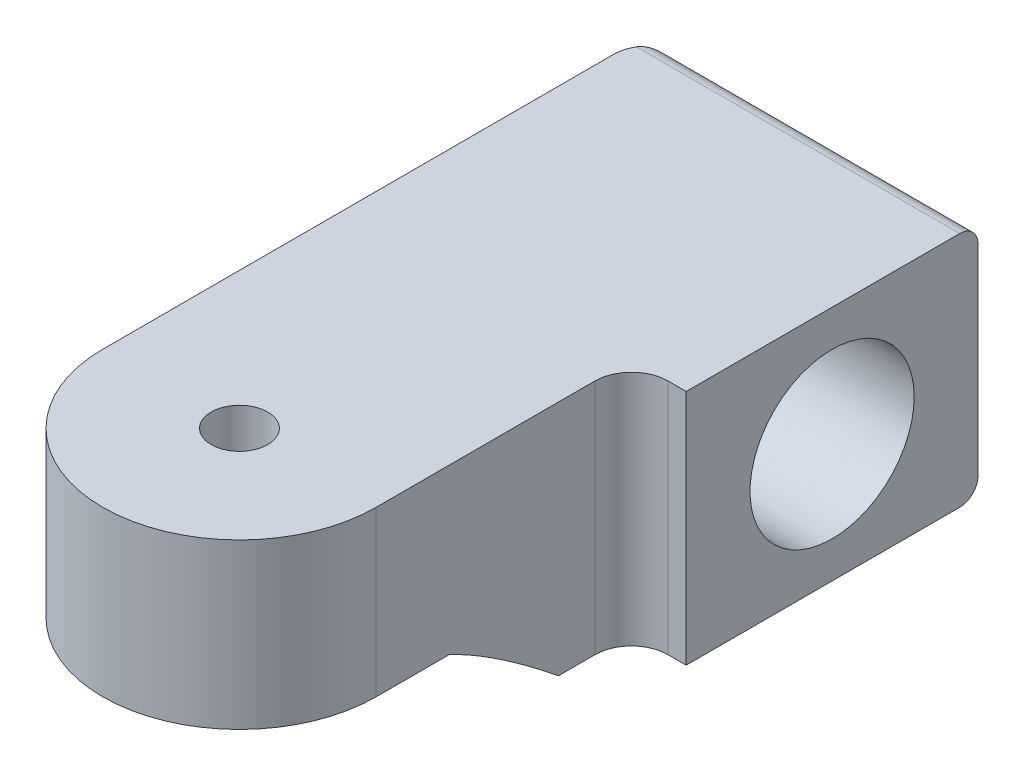
ISO-10303-21;
HEADER;
FILE_DESCRIPTION(('STEP AP214'),'2;1');
FILE_NAME('part.step','',(''),(''),'','','');
FILE_SCHEMA(('AUTOMOTIVE_DESIGN { 1 0 10303 214 1 1 1 1 }'));
ENDSEC;
DATA;
#1=APPLICATION_CONTEXT('core data for automotive mechanical design processes');
#2=APPLICATION_PROTOCOL_DEFINITION('international standard','automotive_design',2000,#1);
#3=PRODUCT_CONTEXT('',#1,'mechanical');
#4=PRODUCT('Part','Part','',(#3));
#5=PRODUCT_RELATED_PRODUCT_CATEGORY('part','',(#4));
#6=PRODUCT_DEFINITION_FORMATION('','',#4);
#7=PRODUCT_DEFINITION_CONTEXT('part definition',#1,'design');
#8=PRODUCT_DEFINITION('design','',#6,#7);
#9=PRODUCT_DEFINITION_SHAPE('','',#8);
#10=(LENGTH_UNIT() NAMED_UNIT(*) SI_UNIT(.MILLI.,.METRE.));
#11=(NAMED_UNIT(*) PLANE_ANGLE_UNIT() SI_UNIT($,.RADIAN.));
#12=(NAMED_UNIT(*) SI_UNIT($,.STERADIAN.) SOLID_ANGLE_UNIT());
#13=UNCERTAINTY_MEASURE_WITH_UNIT(LENGTH_MEASURE(1.E-05),#10,'distance_accuracy_value','');
#14=(GEOMETRIC_REPRESENTATION_CONTEXT(3) GLOBAL_UNCERTAINTY_ASSIGNED_CONTEXT((#13)) GLOBAL_UNIT_ASSIGNED_CONTEXT((#10,
#11,#12)) REPRESENTATION_CONTEXT('',''));
#15=CARTESIAN_POINT('',(0.,0.,0.));
#16=DIRECTION('',(0.,0.,1.));
#17=DIRECTION('',(1.,0.,0.));
#18=AXIS2_PLACEMENT_3D('',#15,#16,#17);
#19=CARTESIAN_POINT('',(-10.5,-2.5,14.));
#20=DIRECTION('',(0.,1.,0.));
#21=DIRECTION('',(0.,0.,1.));
#22=AXIS2_PLACEMENT_3D('',#19,#20,#21);
#23=CYLINDRICAL_SURFACE('',#22,1.55);
#24=CARTESIAN_POINT('',(-10.5,6.5,14.));
#25=DIRECTION('',(0.,1.,0.));
#26=DIRECTION('',(0.,0.,1.));
#27=AXIS2_PLACEMENT_3D('',#24,#25,#26);
#28=CIRCLE('',#27,1.55);
#29=CARTESIAN_POINT('',(-10.5,6.5,15.55));
#30=VERTEX_POINT('',#29);
#31=EDGE_CURVE('E312',#30,#30,#28,.T.);
#32=ORIENTED_EDGE('',*,*,#31,.T.);
#33=EDGE_LOOP('',(#32));
#34=FACE_BOUND('',#33,.T.);
#35=CARTESIAN_POINT('',(-10.5,0.5,14.));
#36=DIRECTION('',(0.,-1.,0.));
#37=DIRECTION('',(0.,0.,-1.));
#38=AXIS2_PLACEMENT_3D('',#35,#36,#37);
#39=CIRCLE('',#38,1.55);
#40=CARTESIAN_POINT('',(-10.5,0.5,12.45));
#41=VERTEX_POINT('',#40);
#42=EDGE_CURVE('E50',#41,#41,#39,.F.);
#43=ORIENTED_EDGE('',*,*,#42,.F.);
#44=EDGE_LOOP('',(#43));
#45=FACE_BOUND('',#44,.T.);
#46=ADVANCED_FACE('F45',(#34,#45),#23,.F.);
#47=CARTESIAN_POINT('',(-3.,6.5,0.));
#48=DIRECTION('',(-1.,0.,0.));
#49=DIRECTION('',(0.,0.,1.));
#50=AXIS2_PLACEMENT_3D('',#47,#48,#49);
#51=PLANE('',#50);
#52=DIRECTION('',(0.,-1.,0.));
#53=VECTOR('',#52,1.);
#54=CARTESIAN_POINT('',(-3.,6.5,14.));
#55=LINE('',#54,#53);
#56=CARTESIAN_POINT('',(-3.,6.5,14.));
#57=VERTEX_POINT('',#56);
#58=CARTESIAN_POINT('',(-3.,-2.5,14.));
#59=VERTEX_POINT('',#58);
#60=EDGE_CURVE('E372',#57,#59,#55,.T.);
#61=ORIENTED_EDGE('',*,*,#60,.T.);
#62=DIRECTION('',(0.,0.,-1.));
#63=VECTOR('',#62,1.);
#64=CARTESIAN_POINT('',(-3.,-2.5,0.));
#65=LINE('',#64,#63);
#66=CARTESIAN_POINT('',(-3.,-2.5,9.99999999999991));
#67=VERTEX_POINT('',#66);
#68=EDGE_CURVE('E483',#59,#67,#65,.T.);
#69=ORIENTED_EDGE('',*,*,#68,.T.);
#70=CARTESIAN_POINT('',(-3.,-1.49999999999996,14.));
#71=CARTESIAN_POINT('',(-3.,-1.49998656227292,13.8846697204429));
#72=CARTESIAN_POINT('',(-3.,-1.50265985955656,13.7693440598278));
#73=CARTESIAN_POINT('',(-3.,-1.51328004838545,13.5389541714104));
#74=CARTESIAN_POINT('',(-3.,-1.52122607156984,13.4238899036898));
#75=CARTESIAN_POINT('',(-3.,-1.54227058298728,13.1944692270754));
#76=CARTESIAN_POINT('',(-3.,-1.55535861217202,13.0801118569425));
#77=CARTESIAN_POINT('',(-3.,-1.58649837912951,12.8520793642863));
#78=CARTESIAN_POINT('',(-3.,-1.60455028699987,12.7384042652788));
#79=CARTESIAN_POINT('',(-3.,-1.66510364962835,12.4026044797598));
#80=CARTESIAN_POINT('',(-3.,-1.71438917562913,12.181676133276));
#81=CARTESIAN_POINT('',(-3.,-1.82909566220671,11.7440237996933));
#82=CARTESIAN_POINT('',(-3.,-1.89452437794567,11.5273018874937));
#83=CARTESIAN_POINT('',(-3.,-2.04614921261427,11.0777505199539));
#84=CARTESIAN_POINT('',(-3.,-2.13374355207286,10.8453958482654));
#85=CARTESIAN_POINT('',(-3.,-2.32256819398413,10.3862811464727));
#86=CARTESIAN_POINT('',(-3.,-2.42380247459628,10.1595227714718));
#87=CARTESIAN_POINT('',(-3.,-2.63752445554123,9.7109706801588));
#88=CARTESIAN_POINT('',(-3.,-2.75002974856276,9.48918540787546));
#89=CARTESIAN_POINT('',(-3.,-2.98405539203611,9.05048818246933));
#90=CARTESIAN_POINT('',(-3.,-3.10557465722147,8.83357564676139));
#91=CARTESIAN_POINT('',(-3.,-3.3578089991897,8.40089870283849));
#92=CARTESIAN_POINT('',(-3.,-3.48863304800174,8.18519811528397));
#93=CARTESIAN_POINT('',(-3.,-3.75647310000332,7.75768321364797));
#94=CARTESIAN_POINT('',(-3.,-3.89348927539044,7.54586900787394));
#95=CARTESIAN_POINT('',(-3.,-4.17250447716423,7.12581131913291));
#96=CARTESIAN_POINT('',(-3.,-4.3144992852469,6.91756502570939));
#97=CARTESIAN_POINT('',(-3.,-4.60271451662507,6.50403200160793));
#98=CARTESIAN_POINT('',(-3.,-4.74893483444322,6.29874519724649));
#99=CARTESIAN_POINT('',(-3.,-5.02699344358803,5.91545914598758));
#100=CARTESIAN_POINT('',(-3.,-5.15842842908993,5.73716660870404));
#101=CARTESIAN_POINT('',(-3.,-5.42366633642223,5.3823415738281));
#102=CARTESIAN_POINT('',(-3.,-5.55746935759606,5.20580915056372));
#103=CARTESIAN_POINT('',(-3.,-5.82508993443689,4.85696471185919));
#104=CARTESIAN_POINT('',(-3.,-5.95887688769646,4.68462918517802));
#105=CARTESIAN_POINT('',(-3.,-6.22819228836265,4.34132761549409));
#106=CARTESIAN_POINT('',(-3.,-6.36372071109842,4.17036155314615));
#107=CARTESIAN_POINT('',(-3.,-6.5,3.9999999999999));
#108=B_SPLINE_CURVE_WITH_KNOTS('',3,(#70,#71,#72,#73,#74,#75,#76,#77,#78,#79,#80,#81,#82,#83,
#84,#85,#86,#87,#88,#89,#90,#91,#92,#93,#94,#95,#96,#97,#98,#99,#100,#101,#102,#103,#104,#105,
#106,#107),.UNSPECIFIED.,.F.,.F.,(4,2,2,2,2,2,2,2,2,2,2,2,2,2,2,2,2,2,4),(0.,0.345952195579146,
0.6918474307129,1.03704271348836,1.38224982657126,2.06056032608555,2.7391973215084,
3.48361180721376,4.2282438771351,4.97405689328953,5.71978026015707,6.47647275040188,
7.23318629656248,7.9892734920125,8.74534183025595,9.40982809728252,10.0743423071168,
10.7288429362165,11.3833343034152),.UNSPECIFIED.);
#109=CARTESIAN_POINT('',(-3.,-6.5,3.9999999999999));
#110=VERTEX_POINT('',#109);
#111=EDGE_CURVE('E485',#67,#110,#108,.T.);
#112=ORIENTED_EDGE('',*,*,#111,.T.);
#113=DIRECTION('',(0.,0.,-1.));
#114=VECTOR('',#113,1.);
#115=CARTESIAN_POINT('',(-3.,-6.5,0.));
#116=LINE('',#115,#114);
#117=CARTESIAN_POINT('',(-3.,-6.5,2.00000000000001));
#118=VERTEX_POINT('',#117);
#119=EDGE_CURVE('E322',#110,#118,#116,.T.);
#120=ORIENTED_EDGE('',*,*,#119,.T.);
#121=DIRECTION('',(0.,-1.,0.));
#122=VECTOR('',#121,1.);
#123=CARTESIAN_POINT('',(-3.,6.5,2.00000000000001));
#124=LINE('',#123,#122);
#125=CARTESIAN_POINT('',(-3.,6.5,2.00000000000001));
#126=VERTEX_POINT('',#125);
#127=EDGE_CURVE('E369',#126,#118,#124,.T.);
#128=ORIENTED_EDGE('',*,*,#127,.F.);
#129=DIRECTION('',(0.,0.,-1.));
#130=VECTOR('',#129,1.);
#131=CARTESIAN_POINT('',(-3.,6.5,0.));
#132=LINE('',#131,#130);
#133=EDGE_CURVE('E325',#57,#126,#132,.T.);
#134=ORIENTED_EDGE('',*,*,#133,.F.);
#135=EDGE_LOOP('',(#61,#69,#112,#120,#128,#134));
#136=FACE_BOUND('',#135,.T.);
#137=ADVANCED_FACE('F439',(#136),#51,.F.);
#138=CARTESIAN_POINT('',(-1.,6.5,2.));
#139=DIRECTION('',(0.,-1.,0.));
#140=DIRECTION('',(0.,0.,-1.));
#141=AXIS2_PLACEMENT_3D('',#138,#139,#140);
#142=CYLINDRICAL_SURFACE('',#141,2.);
#143=CARTESIAN_POINT('',(-1.,-6.5,2.));
#144=DIRECTION('',(0.,1.,0.));
#145=DIRECTION('',(0.,0.,1.));
#146=AXIS2_PLACEMENT_3D('',#143,#144,#145);
#147=CIRCLE('',#146,2.);
#148=CARTESIAN_POINT('',(-0.999999999999986,-6.5,0.));
#149=VERTEX_POINT('',#148);
#150=EDGE_CURVE('E341',#118,#149,#147,.F.);
#151=ORIENTED_EDGE('',*,*,#150,.T.);
#152=DIRECTION('',(0.,-1.,0.));
#153=VECTOR('',#152,1.);
#154=CARTESIAN_POINT('',(-0.999999999999986,6.5,0.));
#155=LINE('',#154,#153);
#156=CARTESIAN_POINT('',(-0.999999999999986,6.5,0.));
#157=VERTEX_POINT('',#156);
#158=EDGE_CURVE('E366',#157,#149,#155,.T.);
#159=ORIENTED_EDGE('',*,*,#158,.F.);
#160=CARTESIAN_POINT('',(-1.,6.5,2.));
#161=DIRECTION('',(0.,1.,0.));
#162=DIRECTION('',(0.,0.,1.));
#163=AXIS2_PLACEMENT_3D('',#160,#161,#162);
#164=CIRCLE('',#163,2.);
#165=EDGE_CURVE('E327',#126,#157,#164,.F.);
#166=ORIENTED_EDGE('',*,*,#165,.F.);
#167=ORIENTED_EDGE('',*,*,#127,.T.);
#168=EDGE_LOOP('',(#151,#159,#166,#167));
#169=FACE_BOUND('',#168,.T.);
#170=ADVANCED_FACE('F447',(#169),#142,.F.);
#171=CARTESIAN_POINT('',(0.,6.5,0.));
#172=DIRECTION('',(0.,0.,-1.));
#173=DIRECTION('',(-1.,0.,0.));
#174=AXIS2_PLACEMENT_3D('',#171,#172,#173);
#175=PLANE('',#174);
#176=DIRECTION('',(1.,0.,0.));
#177=VECTOR('',#176,1.);
#178=CARTESIAN_POINT('',(0.,-6.5,0.));
#179=LINE('',#178,#177);
#180=CARTESIAN_POINT('',(0.,-6.5,0.));
#181=VERTEX_POINT('',#180);
#182=EDGE_CURVE('E343',#149,#181,#179,.T.);
#183=ORIENTED_EDGE('',*,*,#182,.T.);
#184=DIRECTION('',(0.,-1.,0.));
#185=VECTOR('',#184,1.);
#186=CARTESIAN_POINT('',(0.,6.5,0.));
#187=LINE('',#186,#185);
#188=CARTESIAN_POINT('',(0.,6.5,0.));
#189=VERTEX_POINT('',#188);
#190=EDGE_CURVE('E363',#189,#181,#187,.T.);
#191=ORIENTED_EDGE('',*,*,#190,.F.);
#192=DIRECTION('',(1.,0.,0.));
#193=VECTOR('',#192,1.);
#194=CARTESIAN_POINT('',(0.,6.5,0.));
#195=LINE('',#194,#193);
#196=EDGE_CURVE('E330',#157,#189,#195,.T.);
#197=ORIENTED_EDGE('',*,*,#196,.F.);
#198=ORIENTED_EDGE('',*,*,#158,.T.);
#199=EDGE_LOOP('',(#183,#191,#197,#198));
#200=FACE_BOUND('',#199,.T.);
#201=ADVANCED_FACE('F494',(#200),#175,.F.);
#202=CARTESIAN_POINT('',(0.,6.5,0.));
#203=DIRECTION('',(-1.,0.,0.));
#204=DIRECTION('',(0.,0.,1.));
#205=AXIS2_PLACEMENT_3D('',#202,#203,#204);
#206=PLANE('',#205);
#207=CARTESIAN_POINT('',(0.,0.,-8.));
#208=DIRECTION('',(1.,0.,0.));
#209=DIRECTION('',(0.,0.,-1.));
#210=AXIS2_PLACEMENT_3D('',#207,#208,#209);
#211=CIRCLE('',#210,4.5);
#212=CARTESIAN_POINT('',(0.,0.,-12.5));
#213=VERTEX_POINT('',#212);
#214=EDGE_CURVE('E313',#213,#213,#211,.T.);
#215=ORIENTED_EDGE('',*,*,#214,.F.);
#216=EDGE_LOOP('',(#215));
#217=FACE_BOUND('',#216,.T.);
#218=DIRECTION('',(0.,0.,-1.));
#219=VECTOR('',#218,1.);
#220=CARTESIAN_POINT('',(0.,-6.5,0.));
#221=LINE('',#220,#219);
#222=CARTESIAN_POINT('',(0.,-6.5,-15.));
#223=VERTEX_POINT('',#222);
#224=EDGE_CURVE('E345',#181,#223,#221,.T.);
#225=ORIENTED_EDGE('',*,*,#224,.T.);
#226=CARTESIAN_POINT('',(0.,-5.5,-15.));
#227=DIRECTION('',(-1.,0.,0.));
#228=DIRECTION('',(0.,0.,1.));
#229=AXIS2_PLACEMENT_3D('',#226,#227,#228);
#230=CIRCLE('',#229,1.);
#231=CARTESIAN_POINT('',(0.,-5.5,-16.));
#232=VERTEX_POINT('',#231);
#233=EDGE_CURVE('E55',#223,#232,#230,.F.);
#234=ORIENTED_EDGE('',*,*,#233,.T.);
#235=DIRECTION('',(0.,-1.,0.));
#236=VECTOR('',#235,1.);
#237=CARTESIAN_POINT('',(0.,6.5,-16.));
#238=LINE('',#237,#236);
#239=CARTESIAN_POINT('',(0.,5.5,-16.));
#240=VERTEX_POINT('',#239);
#241=EDGE_CURVE('E360',#240,#232,#238,.T.);
#242=ORIENTED_EDGE('',*,*,#241,.F.);
#243=CARTESIAN_POINT('',(0.,5.5,-15.));
#244=DIRECTION('',(-1.,0.,0.));
#245=DIRECTION('',(0.,0.,1.));
#246=AXIS2_PLACEMENT_3D('',#243,#244,#245);
#247=CIRCLE('',#246,1.);
#248=CARTESIAN_POINT('',(0.,6.5,-15.));
#249=VERTEX_POINT('',#248);
#250=EDGE_CURVE('E70',#240,#249,#247,.F.);
#251=ORIENTED_EDGE('',*,*,#250,.T.);
#252=DIRECTION('',(0.,0.,-1.));
#253=VECTOR('',#252,1.);
#254=CARTESIAN_POINT('',(0.,6.5,0.));
#255=LINE('',#254,#253);
#256=EDGE_CURVE('E332',#189,#249,#255,.T.);
#257=ORIENTED_EDGE('',*,*,#256,.F.);
#258=ORIENTED_EDGE('',*,*,#190,.T.);
#259=EDGE_LOOP('',(#225,#234,#242,#251,#257,#258));
#260=FACE_BOUND('',#259,.T.);
#261=ADVANCED_FACE('F497',(#217,#260),#206,.F.);
#262=CARTESIAN_POINT('',(0.,6.5,-16.));
#263=DIRECTION('',(0.,0.,1.));
#264=DIRECTION('',(1.,0.,0.));
#265=AXIS2_PLACEMENT_3D('',#262,#263,#264);
#266=PLANE('',#265);
#267=ORIENTED_EDGE('',*,*,#241,.T.);
#268=DIRECTION('',(-1.,0.,0.));
#269=VECTOR('',#268,1.);
#270=CARTESIAN_POINT('',(0.,-5.5,-16.));
#271=LINE('',#270,#269);
#272=CARTESIAN_POINT('',(-16.,-5.5,-16.));
#273=VERTEX_POINT('',#272);
#274=EDGE_CURVE('E475',#232,#273,#271,.T.);
#275=ORIENTED_EDGE('',*,*,#274,.T.);
#276=DIRECTION('',(0.,-1.,0.));
#277=VECTOR('',#276,1.);
#278=CARTESIAN_POINT('',(-16.,6.5,-16.));
#279=LINE('',#278,#277);
#280=CARTESIAN_POINT('',(-16.,5.5,-16.));
#281=VERTEX_POINT('',#280);
#282=EDGE_CURVE('E357',#281,#273,#279,.T.);
#283=ORIENTED_EDGE('',*,*,#282,.F.);
#284=DIRECTION('',(-1.,0.,0.));
#285=VECTOR('',#284,1.);
#286=CARTESIAN_POINT('',(0.,5.5,-16.));
#287=LINE('',#286,#285);
#288=EDGE_CURVE('E473',#281,#240,#287,.F.);
#289=ORIENTED_EDGE('',*,*,#288,.T.);
#290=EDGE_LOOP('',(#267,#275,#283,#289));
#291=FACE_BOUND('',#290,.T.);
#292=ADVANCED_FACE('F406',(#291),#266,.F.);
#293=CARTESIAN_POINT('',(-16.,6.5,-14.));
#294=DIRECTION('',(0.,-1.,0.));
#295=DIRECTION('',(0.,0.,-1.));
#296=AXIS2_PLACEMENT_3D('',#293,#294,#295);
#297=CYLINDRICAL_SURFACE('',#296,2.);
#298=ORIENTED_EDGE('',*,*,#282,.T.);
#299=CARTESIAN_POINT('',(-17.7320508075689,-6.5,-15.));
#300=CARTESIAN_POINT('',(-17.7104388092232,-6.50000019431164,-15.0374595595264));
#301=CARTESIAN_POINT('',(-17.6876150380168,-6.49789680203802,-15.0741608213529));
#302=CARTESIAN_POINT('',(-17.6399082789937,-6.48998659235741,-15.1456564367995));
#303=CARTESIAN_POINT('',(-17.6150306479842,-6.48418915961089,-15.1804553806859));
#304=CARTESIAN_POINT('',(-17.5638095986444,-6.46948764080382,-15.2475015548441));
#305=CARTESIAN_POINT('',(-17.5374899659552,-6.46062573015754,-15.2797764831557));
#306=CARTESIAN_POINT('',(-17.4833456141586,-6.44021478417789,-15.3421602820682));
#307=CARTESIAN_POINT('',(-17.4555197975357,-6.42866376857337,-15.3722675348846));
#308=CARTESIAN_POINT('',(-17.3593531507907,-6.38576723248944,-15.4701981180782));
#309=CARTESIAN_POINT('',(-17.288019348867,-6.34907849657491,-15.5328256256826));
#310=CARTESIAN_POINT('',(-17.1403637394781,-6.2668123316059,-15.645689170957));
#311=CARTESIAN_POINT('',(-17.0640143376997,-6.2211824117843,-15.6958478590371));
#312=CARTESIAN_POINT('',(-16.8766007270824,-6.10433459554431,-15.8020552410983));
#313=CARTESIAN_POINT('',(-16.7640093602244,-6.03024184432803,-15.8522504250698));
#314=CARTESIAN_POINT('',(-16.5358987111724,-5.87602060504692,-15.9306372251518));
#315=CARTESIAN_POINT('',(-16.4203834138015,-5.79590006593892,-15.9588572812851));
#316=CARTESIAN_POINT('',(-16.2055282598146,-5.64531643884945,-15.9919092696997));
#317=CARTESIAN_POINT('',(-16.1063744279419,-5.57521774764847,-15.9996251042367));
#318=CARTESIAN_POINT('',(-16.0048685950785,-5.50344261611497,-15.9999955508912));
#319=CARTESIAN_POINT('',(-16.0024342684887,-5.50172128716928,-15.9999999948159));
#320=CARTESIAN_POINT('',(-16.,-5.5,-16.));
#321=B_SPLINE_CURVE_WITH_KNOTS('',3,(#299,#300,#301,#302,#303,#304,#305,#306,#307,#308,#309,
#310,#311,#312,#313,#314,#315,#316,#317,#318,#319,#320),.UNSPECIFIED.,.F.,.F.,(4,2,2,2,2,2,2,2,
2,2,4),(0.,0.129592295294594,0.258856668652802,0.386408509268427,0.514054578529992,
0.817592410147204,1.1229686971365,1.55212503753219,1.98072504008936,2.34472916750578,
2.35367344935465),.UNSPECIFIED.);
#322=CARTESIAN_POINT('',(-17.7320508075689,-6.5,-15.));
#323=VERTEX_POINT('',#322);
#324=EDGE_CURVE('E418',#273,#323,#321,.F.);
#325=ORIENTED_EDGE('',*,*,#324,.T.);
#326=CARTESIAN_POINT('',(-16.,-6.5,-14.));
#327=DIRECTION('',(0.,1.,0.));
#328=DIRECTION('',(0.,0.,1.));
#329=AXIS2_PLACEMENT_3D('',#326,#327,#328);
#330=CIRCLE('',#329,2.);
#331=CARTESIAN_POINT('',(-18.,-6.5,-14.));
#332=VERTEX_POINT('',#331);
#333=EDGE_CURVE('E348',#323,#332,#330,.T.);
#334=ORIENTED_EDGE('',*,*,#333,.T.);
#335=DIRECTION('',(0.,-1.,0.));
#336=VECTOR('',#335,1.);
#337=CARTESIAN_POINT('',(-18.,6.5,-14.));
#338=LINE('',#337,#336);
#339=CARTESIAN_POINT('',(-18.,6.5,-14.));
#340=VERTEX_POINT('',#339);
#341=EDGE_CURVE('E354',#340,#332,#338,.T.);
#342=ORIENTED_EDGE('',*,*,#341,.F.);
#343=CARTESIAN_POINT('',(-16.,6.5,-14.));
#344=DIRECTION('',(0.,1.,0.));
#345=DIRECTION('',(0.,0.,1.));
#346=AXIS2_PLACEMENT_3D('',#343,#344,#345);
#347=CIRCLE('',#346,2.);
#348=CARTESIAN_POINT('',(-17.7320508075689,6.5,-15.));
#349=VERTEX_POINT('',#348);
#350=EDGE_CURVE('E334',#349,#340,#347,.T.);
#351=ORIENTED_EDGE('',*,*,#350,.F.);
#352=CARTESIAN_POINT('',(-17.7320508075689,6.5,-15.));
#353=CARTESIAN_POINT('',(-17.7104388092232,6.50000019431164,-15.0374595595264));
#354=CARTESIAN_POINT('',(-17.6876150380168,6.49789680203802,-15.0741608213529));
#355=CARTESIAN_POINT('',(-17.6399082789937,6.48998659235741,-15.1456564367995));
#356=CARTESIAN_POINT('',(-17.6150306479842,6.48418915961089,-15.1804553806859));
#357=CARTESIAN_POINT('',(-17.5638095986444,6.46948764080382,-15.2475015548441));
#358=CARTESIAN_POINT('',(-17.5374899659552,6.46062573015754,-15.2797764831557));
#359=CARTESIAN_POINT('',(-17.4833456141586,6.44021478417789,-15.3421602820682));
#360=CARTESIAN_POINT('',(-17.4555197975357,6.42866376857337,-15.3722675348846));
#361=CARTESIAN_POINT('',(-17.3593531507907,6.38576723248944,-15.4701981180782));
#362=CARTESIAN_POINT('',(-17.288019348867,6.34907849657491,-15.5328256256826));
#363=CARTESIAN_POINT('',(-17.1403637394781,6.26681233160589,-15.645689170957));
#364=CARTESIAN_POINT('',(-17.0640143376997,6.2211824117843,-15.6958478590371));
#365=CARTESIAN_POINT('',(-16.8766007270824,6.10433459554431,-15.8020552410983));
#366=CARTESIAN_POINT('',(-16.7640093602244,6.03024184432803,-15.8522504250698));
#367=CARTESIAN_POINT('',(-16.5358987111724,5.87602060504692,-15.9306372251518));
#368=CARTESIAN_POINT('',(-16.4203834138015,5.79590006593891,-15.9588572812851));
#369=CARTESIAN_POINT('',(-16.2055282598146,5.64531643884945,-15.9919092696997));
#370=CARTESIAN_POINT('',(-16.1063744279418,5.57521774764849,-15.9996251042367));
#371=CARTESIAN_POINT('',(-16.0048685950785,5.50344261611496,-15.9999955508912));
#372=CARTESIAN_POINT('',(-16.0024342684887,5.50172128716928,-15.9999999948159));
#373=CARTESIAN_POINT('',(-16.,5.5,-16.));
#374=B_SPLINE_CURVE_WITH_KNOTS('',3,(#352,#353,#354,#355,#356,#357,#358,#359,#360,#361,#362,
#363,#364,#365,#366,#367,#368,#369,#370,#371,#372,#373),.UNSPECIFIED.,.F.,.F.,(4,2,2,2,2,2,2,2,
2,2,4),(0.,0.129592295294594,0.258856668652802,0.386408509268425,0.514054578529992,
0.817592410147207,1.1229686971365,1.55212503753219,1.98072504008937,2.34472916750578,
2.35367344935466),.UNSPECIFIED.);
#375=EDGE_CURVE('E411',#349,#281,#374,.T.);
#376=ORIENTED_EDGE('',*,*,#375,.T.);
#377=EDGE_LOOP('',(#298,#325,#334,#342,#351,#376));
#378=FACE_BOUND('',#377,.T.);
#379=ADVANCED_FACE('F399',(#378),#297,.T.);
#380=CARTESIAN_POINT('',(-18.,6.5,0.));
#381=DIRECTION('',(1.,0.,0.));
#382=DIRECTION('',(0.,0.,-1.));
#383=AXIS2_PLACEMENT_3D('',#380,#381,#382);
#384=PLANE('',#383);
#385=CARTESIAN_POINT('',(-18.,-6.5,3.9999999999999));
#386=CARTESIAN_POINT('',(-18.,-6.35160599725366,4.18551036488308));
#387=CARTESIAN_POINT('',(-18.,-6.20409888582175,4.37173587653917));
#388=CARTESIAN_POINT('',(-18.,-5.91116643154051,4.74583786659107));
#389=CARTESIAN_POINT('',(-18.,-5.76574123972331,4.93371446318466));
#390=CARTESIAN_POINT('',(-18.,-5.47704872025062,5.31164430989893));
#391=CARTESIAN_POINT('',(-18.,-5.33378563310039,5.50170080453108));
#392=CARTESIAN_POINT('',(-18.,-5.05008974871969,5.8839115417046));
#393=CARTESIAN_POINT('',(-18.,-4.90965689567898,6.07606574276524));
#394=CARTESIAN_POINT('',(-18.,-4.62722548269568,6.46957159043634));
#395=CARTESIAN_POINT('',(-18.,-4.48534593155696,6.67100883803754));
#396=CARTESIAN_POINT('',(-18.,-4.20583114890868,7.07680504979664));
#397=CARTESIAN_POINT('',(-18.,-4.06819579691638,7.28116393077481));
#398=CARTESIAN_POINT('',(-18.,-3.79809884318113,7.69310527494418));
#399=CARTESIAN_POINT('',(-18.,-3.66563412709852,7.90068568907049));
#400=CARTESIAN_POINT('',(-18.,-3.4068753039175,8.31964470609351));
#401=CARTESIAN_POINT('',(-18.,-3.28058071154048,8.53102300849297));
#402=CARTESIAN_POINT('',(-18.,-3.00706233901827,9.00764066024959));
#403=CARTESIAN_POINT('',(-18.,-2.86177725346352,9.27400255354277));
#404=CARTESIAN_POINT('',(-18.,-2.5857927697275,9.81433656262756));
#405=CARTESIAN_POINT('',(-18.,-2.45509689058732,10.0883104946905));
#406=CARTESIAN_POINT('',(-18.,-2.21411851652907,10.6410119198698));
#407=CARTESIAN_POINT('',(-18.,-2.10359608989551,10.9196336425503));
#408=CARTESIAN_POINT('',(-18.,-1.90600955284683,11.4850582230748));
#409=CARTESIAN_POINT('',(-18.,-1.81892866400161,11.7718550660501));
#410=CARTESIAN_POINT('',(-18.,-1.70691732032703,12.2196009460312));
#411=CARTESIAN_POINT('',(-18.,-1.67178874439721,12.3780259674476));
#412=CARTESIAN_POINT('',(-18.,-1.61080294100106,12.696634970598));
#413=CARTESIAN_POINT('',(-18.,-1.58494359818375,12.8568185423987));
#414=CARTESIAN_POINT('',(-18.,-1.54292649995252,13.1804140616938));
#415=CARTESIAN_POINT('',(-18.,-1.52688858999039,13.3438417008759));
#416=CARTESIAN_POINT('',(-18.,-1.50539474636526,13.6715047430406));
#417=CARTESIAN_POINT('',(-18.,-1.49994637534238,13.8357406393939));
#418=CARTESIAN_POINT('',(-18.,-1.49999999999996,14.));
#419=B_SPLINE_CURVE_WITH_KNOTS('',3,(#385,#386,#387,#388,#389,#390,#391,#392,#393,#394,#395,
#396,#397,#398,#399,#400,#401,#402,#403,#404,#405,#406,#407,#408,#409,#410,#411,#412,#413,#414,
#415,#416,#417,#418),.UNSPECIFIED.,.F.,.F.,(4,2,2,2,2,2,2,2,2,2,2,2,2,2,2,2,4),(0.,
0.712684651047021,1.42542074420314,2.13940916895048,2.85338350054074,3.59250000266515,
4.33159550367443,5.07023874394761,5.80882379629126,6.71869362601279,7.62878245201697,
8.52721928233447,9.42501133053195,9.91159718644492,10.3980719267819,10.8903703495632,
11.3830202238849),.UNSPECIFIED.);
#420=CARTESIAN_POINT('',(-18.,-6.5,3.9999999999999));
#421=VERTEX_POINT('',#420);
#422=CARTESIAN_POINT('',(-18.,-2.5,9.99999999999991));
#423=VERTEX_POINT('',#422);
#424=EDGE_CURVE('E378',#421,#423,#419,.T.);
#425=ORIENTED_EDGE('',*,*,#424,.T.);
#426=DIRECTION('',(0.,0.,1.));
#427=VECTOR('',#426,1.);
#428=CARTESIAN_POINT('',(-18.,-2.5,0.));
#429=LINE('',#428,#427);
#430=CARTESIAN_POINT('',(-18.,-2.5,14.));
#431=VERTEX_POINT('',#430);
#432=EDGE_CURVE('E387',#423,#431,#429,.T.);
#433=ORIENTED_EDGE('',*,*,#432,.T.);
#434=DIRECTION('',(0.,-1.,0.));
#435=VECTOR('',#434,1.);
#436=CARTESIAN_POINT('',(-18.,6.5,14.));
#437=LINE('',#436,#435);
#438=CARTESIAN_POINT('',(-18.,6.5,14.));
#439=VERTEX_POINT('',#438);
#440=EDGE_CURVE('E339',#439,#431,#437,.T.);
#441=ORIENTED_EDGE('',*,*,#440,.F.);
#442=DIRECTION('',(0.,0.,1.));
#443=VECTOR('',#442,1.);
#444=CARTESIAN_POINT('',(-18.,6.5,0.));
#445=LINE('',#444,#443);
#446=EDGE_CURVE('E336',#340,#439,#445,.T.);
#447=ORIENTED_EDGE('',*,*,#446,.F.);
#448=ORIENTED_EDGE('',*,*,#341,.T.);
#449=DIRECTION('',(0.,0.,1.));
#450=VECTOR('',#449,1.);
#451=CARTESIAN_POINT('',(-18.,-6.5,0.));
#452=LINE('',#451,#450);
#453=EDGE_CURVE('E328',#332,#421,#452,.T.);
#454=ORIENTED_EDGE('',*,*,#453,.T.);
#455=EDGE_LOOP('',(#425,#433,#441,#447,#448,#454));
#456=FACE_BOUND('',#455,.T.);
#457=ADVANCED_FACE('F393',(#456),#384,.F.);
#458=CARTESIAN_POINT('',(0.,6.5,0.));
#459=DIRECTION('',(0.,1.,0.));
#460=DIRECTION('',(0.,0.,1.));
#461=AXIS2_PLACEMENT_3D('',#458,#459,#460);
#462=PLANE('',#461);
#463=ORIENTED_EDGE('',*,*,#256,.T.);
#464=DIRECTION('',(-1.,0.,0.));
#465=VECTOR('',#464,1.);
#466=CARTESIAN_POINT('',(-16.,6.5,-15.));
#467=LINE('',#466,#465);
#468=EDGE_CURVE('E12',#249,#349,#467,.T.);
#469=ORIENTED_EDGE('',*,*,#468,.T.);
#470=ORIENTED_EDGE('',*,*,#350,.T.);
#471=ORIENTED_EDGE('',*,*,#446,.T.);
#472=CARTESIAN_POINT('',(-10.5,6.5,14.));
#473=DIRECTION('',(0.,1.,0.));
#474=DIRECTION('',(0.,0.,1.));
#475=AXIS2_PLACEMENT_3D('',#472,#473,#474);
#476=CIRCLE('',#475,7.5);
#477=EDGE_CURVE('E318',#439,#57,#476,.T.);
#478=ORIENTED_EDGE('',*,*,#477,.T.);
#479=ORIENTED_EDGE('',*,*,#133,.T.);
#480=ORIENTED_EDGE('',*,*,#165,.T.);
#481=ORIENTED_EDGE('',*,*,#196,.T.);
#482=EDGE_LOOP('',(#463,#469,#470,#471,#478,#479,#480,#481));
#483=FACE_BOUND('',#482,.T.);
#484=ORIENTED_EDGE('',*,*,#31,.F.);
#485=EDGE_LOOP('',(#484));
#486=FACE_BOUND('',#485,.T.);
#487=ADVANCED_FACE('F398',(#483,#486),#462,.T.);
#488=CARTESIAN_POINT('',(0.,-6.5,0.));
#489=DIRECTION('',(0.,1.,0.));
#490=DIRECTION('',(0.,0.,1.));
#491=AXIS2_PLACEMENT_3D('',#488,#489,#490);
#492=PLANE('',#491);
#493=ORIENTED_EDGE('',*,*,#333,.F.);
#494=DIRECTION('',(-1.,0.,0.));
#495=VECTOR('',#494,1.);
#496=CARTESIAN_POINT('',(0.,-6.5,-15.));
#497=LINE('',#496,#495);
#498=EDGE_CURVE('E424',#323,#223,#497,.F.);
#499=ORIENTED_EDGE('',*,*,#498,.T.);
#500=ORIENTED_EDGE('',*,*,#224,.F.);
#501=ORIENTED_EDGE('',*,*,#182,.F.);
#502=ORIENTED_EDGE('',*,*,#150,.F.);
#503=ORIENTED_EDGE('',*,*,#119,.F.);
#504=CARTESIAN_POINT('',(-10.5,-6.5,14.));
#505=DIRECTION('',(0.,1.,0.));
#506=DIRECTION('',(0.,0.,1.));
#507=AXIS2_PLACEMENT_3D('',#504,#505,#506);
#508=CIRCLE('',#507,12.5000000000001);
#509=EDGE_CURVE('E375',#110,#421,#508,.T.);
#510=ORIENTED_EDGE('',*,*,#509,.T.);
#511=ORIENTED_EDGE('',*,*,#453,.F.);
#512=EDGE_LOOP('',(#493,#499,#500,#501,#502,#503,#510,#511));
#513=FACE_BOUND('',#512,.T.);
#514=ADVANCED_FACE('F401',(#513),#492,.F.);
#515=CARTESIAN_POINT('',(-10.5,-2.5,14.));
#516=DIRECTION('',(0.,1.,0.));
#517=DIRECTION('',(0.,0.,1.));
#518=AXIS2_PLACEMENT_3D('',#515,#516,#517);
#519=CYLINDRICAL_SURFACE('',#518,7.5);
#520=CARTESIAN_POINT('',(-10.5,-2.5,14.));
#521=DIRECTION('',(0.,1.,0.));
#522=DIRECTION('',(0.,0.,1.));
#523=AXIS2_PLACEMENT_3D('',#520,#521,#522);
#524=CIRCLE('',#523,7.5);
#525=EDGE_CURVE('E319',#431,#59,#524,.T.);
#526=ORIENTED_EDGE('',*,*,#525,.T.);
#527=ORIENTED_EDGE('',*,*,#60,.F.);
#528=ORIENTED_EDGE('',*,*,#477,.F.);
#529=ORIENTED_EDGE('',*,*,#440,.T.);
#530=EDGE_LOOP('',(#526,#527,#528,#529));
#531=FACE_BOUND('',#530,.T.);
#532=ADVANCED_FACE('F456',(#531),#519,.T.);
#533=CARTESIAN_POINT('',(-10.5,-2.5,14.));
#534=DIRECTION('',(0.,1.,0.));
#535=DIRECTION('',(0.,0.,1.));
#536=AXIS2_PLACEMENT_3D('',#533,#534,#535);
#537=PLANE('',#536);
#538=DIRECTION('',(-0.406655259296254,0.,0.913581687692292));
#539=VECTOR('',#538,1.);
#540=CARTESIAN_POINT('',(-8.00592199260051,-2.5,15.1101688578787));
#541=LINE('',#540,#539);
#542=CARTESIAN_POINT('',(-7.47766131490082,-2.5,13.9233914329179));
#543=VERTEX_POINT('',#542);
#544=CARTESIAN_POINT('',(-8.53418267030017,-2.5,16.2969462828394));
#545=VERTEX_POINT('',#544);
#546=EDGE_CURVE('E260',#543,#545,#541,.T.);
#547=ORIENTED_EDGE('',*,*,#546,.F.);
#548=CARTESIAN_POINT('',(-7.91618052499314,-2.5,13.7281969084558));
#549=DIRECTION('',(0.,-1.,0.));
#550=DIRECTION('',(0.,0.,-1.));
#551=AXIS2_PLACEMENT_3D('',#548,#549,#550);
#552=CIRCLE('',#551,0.48);
#553=CARTESIAN_POINT('',(-7.52787750308308,-2.5,13.4460253946995));
#554=VERTEX_POINT('',#553);
#555=EDGE_CURVE('E62',#554,#543,#552,.T.);
#556=ORIENTED_EDGE('',*,*,#555,.F.);
#557=DIRECTION('',(0.58785732032566,0.,0.808964628979249));
#558=VECTOR('',#557,1.);
#559=CARTESIAN_POINT('',(-8.2915265628871,-2.5,12.3951495155109));
#560=LINE('',#559,#558);
#561=CARTESIAN_POINT('',(-9.05517562269109,-2.5,11.3442736363222));
#562=VERTEX_POINT('',#561);
#563=EDGE_CURVE('E232',#562,#554,#560,.T.);
#564=ORIENTED_EDGE('',*,*,#563,.F.);
#565=CARTESIAN_POINT('',(-9.44347864460113,-2.5,11.6264451500785));
#566=DIRECTION('',(0.,-1.,0.));
#567=DIRECTION('',(0.,0.,-1.));
#568=AXIS2_PLACEMENT_3D('',#565,#566,#567);
#569=CIRCLE('',#568,0.48);
#570=CARTESIAN_POINT('',(-9.49369483278336,-2.5,11.14907911186));
#571=VERTEX_POINT('',#570);
#572=EDGE_CURVE('E235',#571,#562,#569,.T.);
#573=ORIENTED_EDGE('',*,*,#572,.F.);
#574=DIRECTION('',(0.994512579621913,0.,-0.104617058713042));
#575=VECTOR('',#574,1.);
#576=CARTESIAN_POINT('',(-10.785604570287,-2.5,11.2849806576321));
#577=LINE('',#576,#575);
#578=CARTESIAN_POINT('',(-12.0775143077907,-2.5,11.4208822034041));
#579=VERTEX_POINT('',#578);
#580=EDGE_CURVE('E283',#579,#571,#577,.T.);
#581=ORIENTED_EDGE('',*,*,#580,.F.);
#582=CARTESIAN_POINT('',(-12.0272981196084,-2.5,11.8982482416226));
#583=DIRECTION('',(0.,-1.,0.));
#584=DIRECTION('',(0.,0.,-1.));
#585=AXIS2_PLACEMENT_3D('',#582,#583,#584);
#586=CIRCLE('',#585,0.48);
#587=CARTESIAN_POINT('',(-12.4658173297007,-2.5,11.7030537171604));
#588=VERTEX_POINT('',#587);
#589=EDGE_CURVE('E280',#588,#579,#586,.T.);
#590=ORIENTED_EDGE('',*,*,#589,.F.);
#591=DIRECTION('',(0.406655259296257,0.,-0.91358168769229));
#592=VECTOR('',#591,1.);
#593=CARTESIAN_POINT('',(-12.9940780074004,-2.5,12.8898311421211));
#594=LINE('',#593,#592);
#595=CARTESIAN_POINT('',(-13.5223386851001,-2.5,14.0766085670818));
#596=VERTEX_POINT('',#595);
#597=EDGE_CURVE('E277',#596,#588,#594,.T.);
#598=ORIENTED_EDGE('',*,*,#597,.F.);
#599=CARTESIAN_POINT('',(-13.0838194750078,-2.5,14.271803091544));
#600=DIRECTION('',(0.,-1.,0.));
#601=DIRECTION('',(0.,0.,-1.));
#602=AXIS2_PLACEMENT_3D('',#599,#600,#601);
#603=CIRCLE('',#602,0.48);
#604=CARTESIAN_POINT('',(-13.4721224969178,-2.5,14.5539746053003));
#605=VERTEX_POINT('',#604);
#606=EDGE_CURVE('E274',#605,#596,#603,.T.);
#607=ORIENTED_EDGE('',*,*,#606,.F.);
#608=DIRECTION('',(-0.587857320325657,0.,-0.808964628979251));
#609=VECTOR('',#608,1.);
#610=CARTESIAN_POINT('',(-12.7084734371138,-2.5,15.6048504844889));
#611=LINE('',#610,#609);
#612=CARTESIAN_POINT('',(-11.9448243773098,-2.5,16.6557263636776));
#613=VERTEX_POINT('',#612);
#614=EDGE_CURVE('E271',#613,#605,#611,.T.);
#615=ORIENTED_EDGE('',*,*,#614,.F.);
#616=CARTESIAN_POINT('',(-11.5565213553998,-2.5,16.3735548499212));
#617=DIRECTION('',(0.,-1.,0.));
#618=DIRECTION('',(0.,0.,-1.));
#619=AXIS2_PLACEMENT_3D('',#616,#617,#618);
#620=CIRCLE('',#619,0.48);
#621=CARTESIAN_POINT('',(-11.5063051672175,-2.5,16.8509208881398));
#622=VERTEX_POINT('',#621);
#623=EDGE_CURVE('E268',#622,#613,#620,.T.);
#624=ORIENTED_EDGE('',*,*,#623,.F.);
#625=DIRECTION('',(-0.994512579621913,0.,0.10461705871304));
#626=VECTOR('',#625,1.);
#627=CARTESIAN_POINT('',(-10.2143954297139,-2.5,16.7150193423677));
#628=LINE('',#627,#626);
#629=CARTESIAN_POINT('',(-8.9224856922102,-2.5,16.5791177965957));
#630=VERTEX_POINT('',#629);
#631=EDGE_CURVE('E265',#630,#622,#628,.T.);
#632=ORIENTED_EDGE('',*,*,#631,.F.);
#633=CARTESIAN_POINT('',(-8.97270188039246,-2.5,16.1017517583771));
#634=DIRECTION('',(0.,-1.,0.));
#635=DIRECTION('',(0.,0.,-1.));
#636=AXIS2_PLACEMENT_3D('',#633,#634,#635);
#637=CIRCLE('',#636,0.48);
#638=EDGE_CURVE('E262',#545,#630,#637,.T.);
#639=ORIENTED_EDGE('',*,*,#638,.F.);
#640=EDGE_LOOP('',(#547,#556,#564,#573,#581,#590,#598,#607,#615,#624,#632,#639));
#641=FACE_BOUND('',#640,.T.);
#642=ORIENTED_EDGE('',*,*,#432,.F.);
#643=CARTESIAN_POINT('',(-10.5,-2.5,14.));
#644=DIRECTION('',(0.,1.,0.));
#645=DIRECTION('',(0.,0.,1.));
#646=AXIS2_PLACEMENT_3D('',#643,#644,#645);
#647=CIRCLE('',#646,8.50000000000004);
#648=EDGE_CURVE('E479',#423,#67,#647,.F.);
#649=ORIENTED_EDGE('',*,*,#648,.T.);
#650=ORIENTED_EDGE('',*,*,#68,.F.);
#651=ORIENTED_EDGE('',*,*,#525,.F.);
#652=EDGE_LOOP('',(#642,#649,#650,#651));
#653=FACE_BOUND('',#652,.T.);
#654=ADVANCED_FACE('F454',(#641,#653),#537,.F.);
#655=CARTESIAN_POINT('',(-15.,0.,-8.));
#656=DIRECTION('',(1.,0.,0.));
#657=DIRECTION('',(0.,0.,-1.));
#658=AXIS2_PLACEMENT_3D('',#655,#656,#657);
#659=CYLINDRICAL_SURFACE('',#658,4.5);
#660=CARTESIAN_POINT('',(-15.,0.,-8.));
#661=DIRECTION('',(1.,0.,0.));
#662=DIRECTION('',(0.,0.,-1.));
#663=AXIS2_PLACEMENT_3D('',#660,#661,#662);
#664=CIRCLE('',#663,4.5);
#665=CARTESIAN_POINT('',(-15.,0.,-12.5));
#666=VERTEX_POINT('',#665);
#667=EDGE_CURVE('E309',#666,#666,#664,.T.);
#668=ORIENTED_EDGE('',*,*,#667,.F.);
#669=EDGE_LOOP('',(#668));
#670=FACE_BOUND('',#669,.T.);
#671=ORIENTED_EDGE('',*,*,#214,.T.);
#672=EDGE_LOOP('',(#671));
#673=FACE_BOUND('',#672,.T.);
#674=ADVANCED_FACE('F452',(#670,#673),#659,.F.);
#675=CARTESIAN_POINT('',(-15.,0.,0.));
#676=DIRECTION('',(1.,0.,0.));
#677=DIRECTION('',(0.,0.,-1.));
#678=AXIS2_PLACEMENT_3D('',#675,#676,#677);
#679=PLANE('',#678);
#680=ORIENTED_EDGE('',*,*,#667,.T.);
#681=EDGE_LOOP('',(#680));
#682=FACE_BOUND('',#681,.T.);
#683=ADVANCED_FACE('F435',(#682),#679,.T.);
#684=CARTESIAN_POINT('',(-10.5,-6.5,14.));
#685=DIRECTION('',(0.,-1.,0.));
#686=DIRECTION('',(0.,0.,-1.));
#687=AXIS2_PLACEMENT_3D('',#684,#685,#686);
#688=CONICAL_SURFACE('',#687,12.5000000000001,0.785398163397453);
#689=ORIENTED_EDGE('',*,*,#111,.F.);
#690=ORIENTED_EDGE('',*,*,#648,.F.);
#691=ORIENTED_EDGE('',*,*,#424,.F.);
#692=ORIENTED_EDGE('',*,*,#509,.F.);
#693=EDGE_LOOP('',(#689,#690,#691,#692));
#694=FACE_BOUND('',#693,.T.);
#695=ADVANCED_FACE('F390',(#694),#688,.F.);
#696=CARTESIAN_POINT('',(0.,-5.5,-15.));
#697=DIRECTION('',(-1.,0.,0.));
#698=DIRECTION('',(0.,0.,1.));
#699=AXIS2_PLACEMENT_3D('',#696,#697,#698);
#700=CYLINDRICAL_SURFACE('',#699,1.);
#701=ORIENTED_EDGE('',*,*,#233,.F.);
#702=ORIENTED_EDGE('',*,*,#498,.F.);
#703=ORIENTED_EDGE('',*,*,#324,.F.);
#704=ORIENTED_EDGE('',*,*,#274,.F.);
#705=EDGE_LOOP('',(#701,#702,#703,#704));
#706=FACE_BOUND('',#705,.T.);
#707=ADVANCED_FACE('F426',(#706),#700,.T.);
#708=CARTESIAN_POINT('',(0.,5.5,-15.));
#709=DIRECTION('',(1.,0.,0.));
#710=DIRECTION('',(0.,0.,-1.));
#711=AXIS2_PLACEMENT_3D('',#708,#709,#710);
#712=CYLINDRICAL_SURFACE('',#711,1.);
#713=ORIENTED_EDGE('',*,*,#250,.F.);
#714=ORIENTED_EDGE('',*,*,#288,.F.);
#715=ORIENTED_EDGE('',*,*,#375,.F.);
#716=ORIENTED_EDGE('',*,*,#468,.F.);
#717=EDGE_LOOP('',(#713,#714,#715,#716));
#718=FACE_BOUND('',#717,.T.);
#719=ADVANCED_FACE('F47',(#718),#712,.T.);
#720=CARTESIAN_POINT('',(-7.91618052499314,0.5,13.7281969084558));
#721=DIRECTION('',(0.,-1.,0.));
#722=DIRECTION('',(0.,0.,-1.));
#723=AXIS2_PLACEMENT_3D('',#720,#721,#722);
#724=PLANE('',#723);
#725=CARTESIAN_POINT('',(-7.91618052499314,0.5,13.7281969084558));
#726=DIRECTION('',(0.,-1.,0.));
#727=DIRECTION('',(0.,0.,-1.));
#728=AXIS2_PLACEMENT_3D('',#725,#726,#727);
#729=CIRCLE('',#728,0.48);
#730=CARTESIAN_POINT('',(-7.52787750308308,0.5,13.4460253946995));
#731=VERTEX_POINT('',#730);
#732=CARTESIAN_POINT('',(-7.47766131490081,0.5,13.9233914329179));
#733=VERTEX_POINT('',#732);
#734=EDGE_CURVE('E212',#731,#733,#729,.T.);
#735=ORIENTED_EDGE('',*,*,#734,.T.);
#736=DIRECTION('',(-0.406655259296265,0.,0.913581687692287));
#737=VECTOR('',#736,1.);
#738=CARTESIAN_POINT('',(-7.47766131490081,0.5,13.9233914329179));
#739=LINE('',#738,#737);
#740=CARTESIAN_POINT('',(-8.53418267030017,0.5,16.2969462828394));
#741=VERTEX_POINT('',#740);
#742=EDGE_CURVE('E220',#733,#741,#739,.T.);
#743=ORIENTED_EDGE('',*,*,#742,.T.);
#744=CARTESIAN_POINT('',(-8.97270188039246,0.5,16.1017517583771));
#745=DIRECTION('',(0.,-1.,0.));
#746=DIRECTION('',(0.,0.,-1.));
#747=AXIS2_PLACEMENT_3D('',#744,#745,#746);
#748=CIRCLE('',#747,0.48);
#749=CARTESIAN_POINT('',(-8.9224856922102,0.5,16.5791177965957));
#750=VERTEX_POINT('',#749);
#751=EDGE_CURVE('E225',#741,#750,#748,.T.);
#752=ORIENTED_EDGE('',*,*,#751,.T.);
#753=DIRECTION('',(-0.994512579621914,0.,0.104617058713036));
#754=VECTOR('',#753,1.);
#755=CARTESIAN_POINT('',(-8.9224856922102,0.5,16.5791177965957));
#756=LINE('',#755,#754);
#757=CARTESIAN_POINT('',(-11.5063051672175,0.5,16.8509208881398));
#758=VERTEX_POINT('',#757);
#759=EDGE_CURVE('E239',#750,#758,#756,.T.);
#760=ORIENTED_EDGE('',*,*,#759,.T.);
#761=CARTESIAN_POINT('',(-11.5565213553998,0.5,16.3735548499212));
#762=DIRECTION('',(0.,-1.,0.));
#763=DIRECTION('',(0.,0.,-1.));
#764=AXIS2_PLACEMENT_3D('',#761,#762,#763);
#765=CIRCLE('',#764,0.48);
#766=CARTESIAN_POINT('',(-11.9448243773098,0.5,16.6557263636776));
#767=VERTEX_POINT('',#766);
#768=EDGE_CURVE('E241',#758,#767,#765,.T.);
#769=ORIENTED_EDGE('',*,*,#768,.T.);
#770=DIRECTION('',(-0.587857320325653,0.,-0.808964628979254));
#771=VECTOR('',#770,1.);
#772=CARTESIAN_POINT('',(-11.9448243773098,0.5,16.6557263636776));
#773=LINE('',#772,#771);
#774=CARTESIAN_POINT('',(-13.4721224969178,0.5,14.5539746053003));
#775=VERTEX_POINT('',#774);
#776=EDGE_CURVE('E244',#767,#775,#773,.T.);
#777=ORIENTED_EDGE('',*,*,#776,.T.);
#778=CARTESIAN_POINT('',(-13.0838194750078,0.5,14.271803091544));
#779=DIRECTION('',(0.,-1.,0.));
#780=DIRECTION('',(0.,0.,-1.));
#781=AXIS2_PLACEMENT_3D('',#778,#779,#780);
#782=CIRCLE('',#781,0.48);
#783=CARTESIAN_POINT('',(-13.5223386851001,0.5,14.0766085670818));
#784=VERTEX_POINT('',#783);
#785=EDGE_CURVE('E246',#775,#784,#782,.T.);
#786=ORIENTED_EDGE('',*,*,#785,.T.);
#787=DIRECTION('',(0.406655259296262,0.,-0.913581687692289));
#788=VECTOR('',#787,1.);
#789=CARTESIAN_POINT('',(-13.5223386851001,0.5,14.0766085670818));
#790=LINE('',#789,#788);
#791=CARTESIAN_POINT('',(-12.4658173297007,0.5,11.7030537171604));
#792=VERTEX_POINT('',#791);
#793=EDGE_CURVE('E249',#784,#792,#790,.T.);
#794=ORIENTED_EDGE('',*,*,#793,.T.);
#795=CARTESIAN_POINT('',(-12.0272981196084,0.5,11.8982482416226));
#796=DIRECTION('',(0.,-1.,0.));
#797=DIRECTION('',(0.,0.,-1.));
#798=AXIS2_PLACEMENT_3D('',#795,#796,#797);
#799=CIRCLE('',#798,0.48);
#800=CARTESIAN_POINT('',(-12.0775143077907,0.5,11.4208822034041));
#801=VERTEX_POINT('',#800);
#802=EDGE_CURVE('E251',#792,#801,#799,.T.);
#803=ORIENTED_EDGE('',*,*,#802,.T.);
#804=DIRECTION('',(0.994512579621914,0.,-0.104617058713029));
#805=VECTOR('',#804,1.);
#806=CARTESIAN_POINT('',(-12.0775143077907,0.5,11.4208822034041));
#807=LINE('',#806,#805);
#808=CARTESIAN_POINT('',(-9.49369483278336,0.5,11.14907911186));
#809=VERTEX_POINT('',#808);
#810=EDGE_CURVE('E254',#801,#809,#807,.T.);
#811=ORIENTED_EDGE('',*,*,#810,.T.);
#812=CARTESIAN_POINT('',(-9.44347864460113,0.5,11.6264451500785));
#813=DIRECTION('',(0.,-1.,0.));
#814=DIRECTION('',(0.,0.,-1.));
#815=AXIS2_PLACEMENT_3D('',#812,#813,#814);
#816=CIRCLE('',#815,0.48);
#817=CARTESIAN_POINT('',(-9.05517562269109,0.5,11.3442736363222));
#818=VERTEX_POINT('',#817);
#819=EDGE_CURVE('E256',#809,#818,#816,.T.);
#820=ORIENTED_EDGE('',*,*,#819,.T.);
#821=DIRECTION('',(0.58785732032565,0.,0.808964628979257));
#822=VECTOR('',#821,1.);
#823=CARTESIAN_POINT('',(-9.05517562269109,0.5,11.3442736363222));
#824=LINE('',#823,#822);
#825=EDGE_CURVE('E217',#818,#731,#824,.T.);
#826=ORIENTED_EDGE('',*,*,#825,.T.);
#827=EDGE_LOOP('',(#735,#743,#752,#760,#769,#777,#786,#794,#803,#811,#820,#826));
#828=FACE_BOUND('',#827,.T.);
#829=ORIENTED_EDGE('',*,*,#42,.T.);
#830=EDGE_LOOP('',(#829));
#831=FACE_BOUND('',#830,.T.);
#832=ADVANCED_FACE('F227',(#828,#831),#724,.T.);
#833=CARTESIAN_POINT('',(-7.91618052499314,0.5,13.7281969084558));
#834=DIRECTION('',(0.,-1.,0.));
#835=DIRECTION('',(0.,0.,-1.));
#836=AXIS2_PLACEMENT_3D('',#833,#834,#835);
#837=CYLINDRICAL_SURFACE('',#836,0.48);
#838=ORIENTED_EDGE('',*,*,#555,.T.);
#839=DIRECTION('',(0.,-1.,0.));
#840=VECTOR('',#839,1.);
#841=CARTESIAN_POINT('',(-7.47766131490081,0.5,13.9233914329179));
#842=LINE('',#841,#840);
#843=EDGE_CURVE('E208',#733,#543,#842,.T.);
#844=ORIENTED_EDGE('',*,*,#843,.F.);
#845=ORIENTED_EDGE('',*,*,#734,.F.);
#846=DIRECTION('',(0.,-1.,0.));
#847=VECTOR('',#846,1.);
#848=CARTESIAN_POINT('',(-7.52787750308308,0.5,13.4460253946995));
#849=LINE('',#848,#847);
#850=EDGE_CURVE('E288',#731,#554,#849,.T.);
#851=ORIENTED_EDGE('',*,*,#850,.T.);
#852=EDGE_LOOP('',(#838,#844,#845,#851));
#853=FACE_BOUND('',#852,.T.);
#854=ADVANCED_FACE('F210',(#853),#837,.F.);
#855=CARTESIAN_POINT('',(-8.2915265628871,0.5,12.3951495155109));
#856=DIRECTION('',(0.808964628979249,0.,-0.58785732032566));
#857=DIRECTION('',(-0.58785732032566,0.,-0.808964628979249));
#858=AXIS2_PLACEMENT_3D('',#855,#856,#857);
#859=PLANE('',#858);
#860=ORIENTED_EDGE('',*,*,#563,.T.);
#861=ORIENTED_EDGE('',*,*,#850,.F.);
#862=ORIENTED_EDGE('',*,*,#825,.F.);
#863=DIRECTION('',(0.,-1.,0.));
#864=VECTOR('',#863,1.);
#865=CARTESIAN_POINT('',(-9.05517562269109,0.5,11.3442736363222));
#866=LINE('',#865,#864);
#867=EDGE_CURVE('E290',#818,#562,#866,.T.);
#868=ORIENTED_EDGE('',*,*,#867,.T.);
#869=EDGE_LOOP('',(#860,#861,#862,#868));
#870=FACE_BOUND('',#869,.T.);
#871=ADVANCED_FACE('F539',(#870),#859,.F.);
#872=CARTESIAN_POINT('',(-9.44347864460113,0.5,11.6264451500785));
#873=DIRECTION('',(0.,-1.,0.));
#874=DIRECTION('',(0.,0.,-1.));
#875=AXIS2_PLACEMENT_3D('',#872,#873,#874);
#876=CYLINDRICAL_SURFACE('',#875,0.48);
#877=ORIENTED_EDGE('',*,*,#572,.T.);
#878=ORIENTED_EDGE('',*,*,#867,.F.);
#879=ORIENTED_EDGE('',*,*,#819,.F.);
#880=DIRECTION('',(0.,-1.,0.));
#881=VECTOR('',#880,1.);
#882=CARTESIAN_POINT('',(-9.49369483278336,0.5,11.14907911186));
#883=LINE('',#882,#881);
#884=EDGE_CURVE('E292',#809,#571,#883,.T.);
#885=ORIENTED_EDGE('',*,*,#884,.T.);
#886=EDGE_LOOP('',(#877,#878,#879,#885));
#887=FACE_BOUND('',#886,.T.);
#888=ADVANCED_FACE('F573',(#887),#876,.F.);
#889=CARTESIAN_POINT('',(-10.785604570287,0.5,11.2849806576321));
#890=DIRECTION('',(-0.104617058713042,0.,-0.994512579621913));
#891=DIRECTION('',(-0.994512579621913,0.,0.104617058713042));
#892=AXIS2_PLACEMENT_3D('',#889,#890,#891);
#893=PLANE('',#892);
#894=ORIENTED_EDGE('',*,*,#580,.T.);
#895=ORIENTED_EDGE('',*,*,#884,.F.);
#896=ORIENTED_EDGE('',*,*,#810,.F.);
#897=DIRECTION('',(0.,-1.,0.));
#898=VECTOR('',#897,1.);
#899=CARTESIAN_POINT('',(-12.0775143077907,0.5,11.4208822034041));
#900=LINE('',#899,#898);
#901=EDGE_CURVE('E294',#801,#579,#900,.T.);
#902=ORIENTED_EDGE('',*,*,#901,.T.);
#903=EDGE_LOOP('',(#894,#895,#896,#902));
#904=FACE_BOUND('',#903,.T.);
#905=ADVANCED_FACE('F569',(#904),#893,.F.);
#906=CARTESIAN_POINT('',(-12.0272981196084,0.5,11.8982482416226));
#907=DIRECTION('',(0.,-1.,0.));
#908=DIRECTION('',(0.,0.,-1.));
#909=AXIS2_PLACEMENT_3D('',#906,#907,#908);
#910=CYLINDRICAL_SURFACE('',#909,0.48);
#911=ORIENTED_EDGE('',*,*,#589,.T.);
#912=ORIENTED_EDGE('',*,*,#901,.F.);
#913=ORIENTED_EDGE('',*,*,#802,.F.);
#914=DIRECTION('',(0.,-1.,0.));
#915=VECTOR('',#914,1.);
#916=CARTESIAN_POINT('',(-12.4658173297007,0.5,11.7030537171604));
#917=LINE('',#916,#915);
#918=EDGE_CURVE('E296',#792,#588,#917,.T.);
#919=ORIENTED_EDGE('',*,*,#918,.T.);
#920=EDGE_LOOP('',(#911,#912,#913,#919));
#921=FACE_BOUND('',#920,.T.);
#922=ADVANCED_FACE('F565',(#921),#910,.F.);
#923=CARTESIAN_POINT('',(-12.9940780074004,0.5,12.8898311421211));
#924=DIRECTION('',(-0.91358168769229,0.,-0.406655259296257));
#925=DIRECTION('',(-0.406655259296258,0.,0.913581687692291));
#926=AXIS2_PLACEMENT_3D('',#923,#924,#925);
#927=PLANE('',#926);
#928=ORIENTED_EDGE('',*,*,#597,.T.);
#929=ORIENTED_EDGE('',*,*,#918,.F.);
#930=ORIENTED_EDGE('',*,*,#793,.F.);
#931=DIRECTION('',(0.,-1.,0.));
#932=VECTOR('',#931,1.);
#933=CARTESIAN_POINT('',(-13.5223386851001,0.5,14.0766085670818));
#934=LINE('',#933,#932);
#935=EDGE_CURVE('E298',#784,#596,#934,.T.);
#936=ORIENTED_EDGE('',*,*,#935,.T.);
#937=EDGE_LOOP('',(#928,#929,#930,#936));
#938=FACE_BOUND('',#937,.T.);
#939=ADVANCED_FACE('F561',(#938),#927,.F.);
#940=CARTESIAN_POINT('',(-13.0838194750078,0.5,14.271803091544));
#941=DIRECTION('',(0.,-1.,0.));
#942=DIRECTION('',(0.,0.,-1.));
#943=AXIS2_PLACEMENT_3D('',#940,#941,#942);
#944=CYLINDRICAL_SURFACE('',#943,0.48);
#945=ORIENTED_EDGE('',*,*,#606,.T.);
#946=ORIENTED_EDGE('',*,*,#935,.F.);
#947=ORIENTED_EDGE('',*,*,#785,.F.);
#948=DIRECTION('',(0.,-1.,0.));
#949=VECTOR('',#948,1.);
#950=CARTESIAN_POINT('',(-13.4721224969178,0.5,14.5539746053003));
#951=LINE('',#950,#949);
#952=EDGE_CURVE('E300',#775,#605,#951,.T.);
#953=ORIENTED_EDGE('',*,*,#952,.T.);
#954=EDGE_LOOP('',(#945,#946,#947,#953));
#955=FACE_BOUND('',#954,.T.);
#956=ADVANCED_FACE('F557',(#955),#944,.F.);
#957=CARTESIAN_POINT('',(-12.7084734371138,0.5,15.6048504844889));
#958=DIRECTION('',(-0.808964628979251,0.,0.587857320325657));
#959=DIRECTION('',(0.587857320325657,0.,0.808964628979251));
#960=AXIS2_PLACEMENT_3D('',#957,#958,#959);
#961=PLANE('',#960);
#962=ORIENTED_EDGE('',*,*,#614,.T.);
#963=ORIENTED_EDGE('',*,*,#952,.F.);
#964=ORIENTED_EDGE('',*,*,#776,.F.);
#965=DIRECTION('',(0.,-1.,0.));
#966=VECTOR('',#965,1.);
#967=CARTESIAN_POINT('',(-11.9448243773098,0.5,16.6557263636776));
#968=LINE('',#967,#966);
#969=EDGE_CURVE('E302',#767,#613,#968,.T.);
#970=ORIENTED_EDGE('',*,*,#969,.T.);
#971=EDGE_LOOP('',(#962,#963,#964,#970));
#972=FACE_BOUND('',#971,.T.);
#973=ADVANCED_FACE('F553',(#972),#961,.F.);
#974=CARTESIAN_POINT('',(-11.5565213553998,0.5,16.3735548499212));
#975=DIRECTION('',(0.,-1.,0.));
#976=DIRECTION('',(0.,0.,-1.));
#977=AXIS2_PLACEMENT_3D('',#974,#975,#976);
#978=CYLINDRICAL_SURFACE('',#977,0.48);
#979=ORIENTED_EDGE('',*,*,#623,.T.);
#980=ORIENTED_EDGE('',*,*,#969,.F.);
#981=ORIENTED_EDGE('',*,*,#768,.F.);
#982=DIRECTION('',(0.,-1.,0.));
#983=VECTOR('',#982,1.);
#984=CARTESIAN_POINT('',(-11.5063051672175,0.5,16.8509208881398));
#985=LINE('',#984,#983);
#986=EDGE_CURVE('E304',#758,#622,#985,.T.);
#987=ORIENTED_EDGE('',*,*,#986,.T.);
#988=EDGE_LOOP('',(#979,#980,#981,#987));
#989=FACE_BOUND('',#988,.T.);
#990=ADVANCED_FACE('F549',(#989),#978,.F.);
#991=CARTESIAN_POINT('',(-10.2143954297139,0.5,16.7150193423677));
#992=DIRECTION('',(0.10461705871304,0.,0.994512579621913));
#993=DIRECTION('',(0.994512579621913,0.,-0.10461705871304));
#994=AXIS2_PLACEMENT_3D('',#991,#992,#993);
#995=PLANE('',#994);
#996=ORIENTED_EDGE('',*,*,#631,.T.);
#997=ORIENTED_EDGE('',*,*,#986,.F.);
#998=ORIENTED_EDGE('',*,*,#759,.F.);
#999=DIRECTION('',(0.,-1.,0.));
#1000=VECTOR('',#999,1.);
#1001=CARTESIAN_POINT('',(-8.9224856922102,0.5,16.5791177965957));
#1002=LINE('',#1001,#1000);
#1003=EDGE_CURVE('E306',#750,#630,#1002,.T.);
#1004=ORIENTED_EDGE('',*,*,#1003,.T.);
#1005=EDGE_LOOP('',(#996,#997,#998,#1004));
#1006=FACE_BOUND('',#1005,.T.);
#1007=ADVANCED_FACE('F545',(#1006),#995,.F.);
#1008=CARTESIAN_POINT('',(-8.97270188039246,0.5,16.1017517583771));
#1009=DIRECTION('',(0.,-1.,0.));
#1010=DIRECTION('',(0.,0.,-1.));
#1011=AXIS2_PLACEMENT_3D('',#1008,#1009,#1010);
#1012=CYLINDRICAL_SURFACE('',#1011,0.48);
#1013=ORIENTED_EDGE('',*,*,#638,.T.);
#1014=ORIENTED_EDGE('',*,*,#1003,.F.);
#1015=ORIENTED_EDGE('',*,*,#751,.F.);
#1016=DIRECTION('',(0.,-1.,0.));
#1017=VECTOR('',#1016,1.);
#1018=CARTESIAN_POINT('',(-8.53418267030017,0.5,16.2969462828394));
#1019=LINE('',#1018,#1017);
#1020=EDGE_CURVE('E216',#741,#545,#1019,.T.);
#1021=ORIENTED_EDGE('',*,*,#1020,.T.);
#1022=EDGE_LOOP('',(#1013,#1014,#1015,#1021));
#1023=FACE_BOUND('',#1022,.T.);
#1024=ADVANCED_FACE('F542',(#1023),#1012,.F.);
#1025=CARTESIAN_POINT('',(-8.00592199260051,0.5,15.1101688578787));
#1026=DIRECTION('',(0.913581687692292,0.,0.406655259296254));
#1027=DIRECTION('',(0.406655259296254,0.,-0.913581687692292));
#1028=AXIS2_PLACEMENT_3D('',#1025,#1026,#1027);
#1029=PLANE('',#1028);
#1030=ORIENTED_EDGE('',*,*,#546,.T.);
#1031=ORIENTED_EDGE('',*,*,#1020,.F.);
#1032=ORIENTED_EDGE('',*,*,#742,.F.);
#1033=ORIENTED_EDGE('',*,*,#843,.T.);
#1034=EDGE_LOOP('',(#1030,#1031,#1032,#1033));
#1035=FACE_BOUND('',#1034,.T.);
#1036=ADVANCED_FACE('F221',(#1035),#1029,.F.);
#1037=CLOSED_SHELL('',(#46,#137,#170,#201,#261,#292,#379,#457,#487,#514,#532,#654,#674,#683,
#695,#707,#719,#832,#854,#871,#888,#905,#922,#939,#956,#973,#990,#1007,#1024,#1036));
#1038=MANIFOLD_SOLID_BREP('B2',#1037);
#1039=ADVANCED_BREP_SHAPE_REPRESENTATION('',(#18,#1038),#14);
#1040=SHAPE_DEFINITION_REPRESENTATION(#9,#1039);
ENDSEC;
END-ISO-10303-21;
